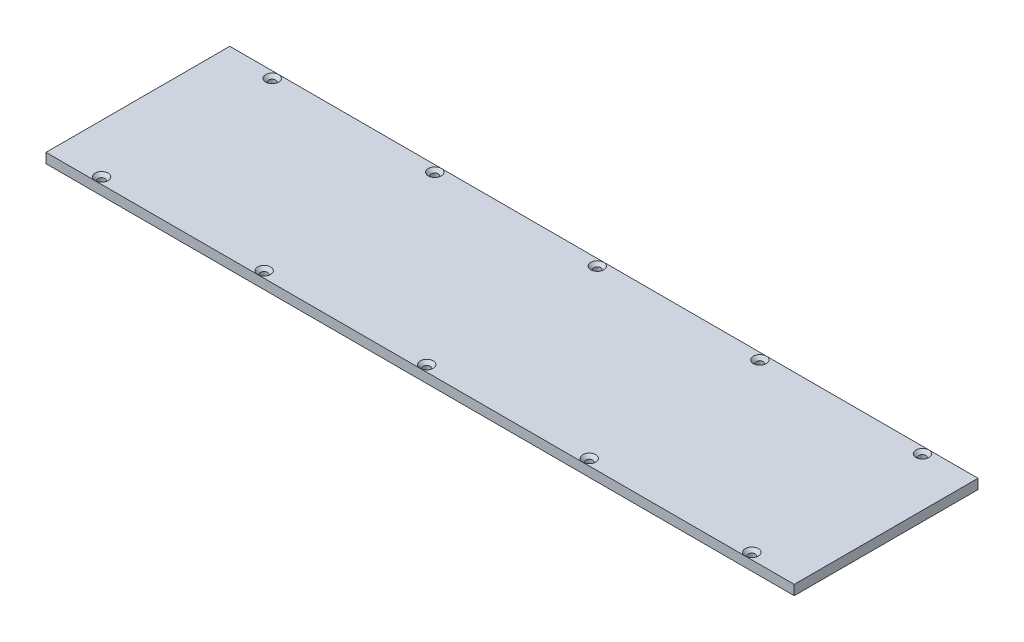
ISO-10303-21;
HEADER;
FILE_DESCRIPTION(('STEP AP214'),'2;1');
FILE_NAME('part.step','',(''),(''),'','','');
FILE_SCHEMA(('AUTOMOTIVE_DESIGN { 1 0 10303 214 1 1 1 1 }'));
ENDSEC;
DATA;
#1=APPLICATION_CONTEXT('core data for automotive mechanical design processes');
#2=APPLICATION_PROTOCOL_DEFINITION('international standard','automotive_design',2000,#1);
#3=PRODUCT_CONTEXT('',#1,'mechanical');
#4=PRODUCT('Part','Part','',(#3));
#5=PRODUCT_RELATED_PRODUCT_CATEGORY('part','',(#4));
#6=PRODUCT_DEFINITION_FORMATION('','',#4);
#7=PRODUCT_DEFINITION_CONTEXT('part definition',#1,'design');
#8=PRODUCT_DEFINITION('design','',#6,#7);
#9=PRODUCT_DEFINITION_SHAPE('','',#8);
#10=(LENGTH_UNIT() NAMED_UNIT(*) SI_UNIT(.MILLI.,.METRE.));
#11=(NAMED_UNIT(*) PLANE_ANGLE_UNIT() SI_UNIT($,.RADIAN.));
#12=(NAMED_UNIT(*) SI_UNIT($,.STERADIAN.) SOLID_ANGLE_UNIT());
#13=UNCERTAINTY_MEASURE_WITH_UNIT(LENGTH_MEASURE(1.E-05),#10,'distance_accuracy_value','');
#14=(GEOMETRIC_REPRESENTATION_CONTEXT(3) GLOBAL_UNCERTAINTY_ASSIGNED_CONTEXT((#13)) GLOBAL_UNIT_ASSIGNED_CONTEXT((#10,
#11,#12)) REPRESENTATION_CONTEXT('',''));
#15=CARTESIAN_POINT('',(0.,0.,0.));
#16=DIRECTION('',(0.,0.,1.));
#17=DIRECTION('',(1.,0.,0.));
#18=AXIS2_PLACEMENT_3D('',#15,#16,#17);
#19=CARTESIAN_POINT('',(361.95,9.525,88.9));
#20=DIRECTION('',(-1.,0.,0.));
#21=DIRECTION('',(0.,0.,1.));
#22=AXIS2_PLACEMENT_3D('',#19,#20,#21);
#23=PLANE('',#22);
#24=DIRECTION('',(0.,0.,-1.));
#25=VECTOR('',#24,1.);
#26=CARTESIAN_POINT('',(361.95,0.,88.9));
#27=LINE('',#26,#25);
#28=CARTESIAN_POINT('',(361.95,0.,88.9));
#29=VERTEX_POINT('',#28);
#30=CARTESIAN_POINT('',(361.95,0.,-88.9));
#31=VERTEX_POINT('',#30);
#32=EDGE_CURVE('E101',#29,#31,#27,.T.);
#33=ORIENTED_EDGE('',*,*,#32,.T.);
#34=DIRECTION('',(0.,-1.,0.));
#35=VECTOR('',#34,1.);
#36=CARTESIAN_POINT('',(361.95,9.525,-88.9));
#37=LINE('',#36,#35);
#38=CARTESIAN_POINT('',(361.95,9.525,-88.9));
#39=VERTEX_POINT('',#38);
#40=EDGE_CURVE('E11',#39,#31,#37,.T.);
#41=ORIENTED_EDGE('',*,*,#40,.F.);
#42=DIRECTION('',(0.,0.,-1.));
#43=VECTOR('',#42,1.);
#44=CARTESIAN_POINT('',(361.95,9.525,88.9));
#45=LINE('',#44,#43);
#46=CARTESIAN_POINT('',(361.95,9.525,88.9));
#47=VERTEX_POINT('',#46);
#48=EDGE_CURVE('E89',#47,#39,#45,.T.);
#49=ORIENTED_EDGE('',*,*,#48,.F.);
#50=DIRECTION('',(0.,-1.,0.));
#51=VECTOR('',#50,1.);
#52=CARTESIAN_POINT('',(361.95,9.525,88.9));
#53=LINE('',#52,#51);
#54=EDGE_CURVE('E97',#47,#29,#53,.T.);
#55=ORIENTED_EDGE('',*,*,#54,.T.);
#56=EDGE_LOOP('',(#33,#41,#49,#55));
#57=FACE_BOUND('',#56,.T.);
#58=ADVANCED_FACE('F38',(#57),#23,.F.);
#59=CARTESIAN_POINT('',(-361.95,9.525,-88.9));
#60=DIRECTION('',(0.,0.,1.));
#61=DIRECTION('',(1.,0.,0.));
#62=AXIS2_PLACEMENT_3D('',#59,#60,#61);
#63=PLANE('',#62);
#64=DIRECTION('',(-1.,0.,0.));
#65=VECTOR('',#64,1.);
#66=CARTESIAN_POINT('',(-361.95,0.,-88.9));
#67=LINE('',#66,#65);
#68=CARTESIAN_POINT('',(-361.95,0.,-88.9));
#69=VERTEX_POINT('',#68);
#70=EDGE_CURVE('E93',#31,#69,#67,.T.);
#71=ORIENTED_EDGE('',*,*,#70,.T.);
#72=DIRECTION('',(0.,-1.,0.));
#73=VECTOR('',#72,1.);
#74=CARTESIAN_POINT('',(-361.95,9.525,-88.9));
#75=LINE('',#74,#73);
#76=CARTESIAN_POINT('',(-361.95,9.525,-88.9));
#77=VERTEX_POINT('',#76);
#78=EDGE_CURVE('E46',#77,#69,#75,.T.);
#79=ORIENTED_EDGE('',*,*,#78,.F.);
#80=DIRECTION('',(-1.,0.,0.));
#81=VECTOR('',#80,1.);
#82=CARTESIAN_POINT('',(-361.95,9.525,-88.9));
#83=LINE('',#82,#81);
#84=EDGE_CURVE('E84',#39,#77,#83,.T.);
#85=ORIENTED_EDGE('',*,*,#84,.F.);
#86=ORIENTED_EDGE('',*,*,#40,.T.);
#87=EDGE_LOOP('',(#71,#79,#85,#86));
#88=FACE_BOUND('',#87,.T.);
#89=ADVANCED_FACE('F92',(#88),#63,.F.);
#90=CARTESIAN_POINT('',(-361.95,9.525,88.9));
#91=DIRECTION('',(1.,0.,0.));
#92=DIRECTION('',(0.,0.,-1.));
#93=AXIS2_PLACEMENT_3D('',#90,#91,#92);
#94=PLANE('',#93);
#95=DIRECTION('',(0.,0.,1.));
#96=VECTOR('',#95,1.);
#97=CARTESIAN_POINT('',(-361.95,0.,88.9));
#98=LINE('',#97,#96);
#99=CARTESIAN_POINT('',(-361.95,0.,88.9));
#100=VERTEX_POINT('',#99);
#101=EDGE_CURVE('E71',#69,#100,#98,.T.);
#102=ORIENTED_EDGE('',*,*,#101,.T.);
#103=DIRECTION('',(0.,-1.,0.));
#104=VECTOR('',#103,1.);
#105=CARTESIAN_POINT('',(-361.95,9.525,88.9));
#106=LINE('',#105,#104);
#107=CARTESIAN_POINT('',(-361.95,9.525,88.9));
#108=VERTEX_POINT('',#107);
#109=EDGE_CURVE('E94',#108,#100,#106,.T.);
#110=ORIENTED_EDGE('',*,*,#109,.F.);
#111=DIRECTION('',(0.,0.,1.));
#112=VECTOR('',#111,1.);
#113=CARTESIAN_POINT('',(-361.95,9.525,88.9));
#114=LINE('',#113,#112);
#115=EDGE_CURVE('E87',#77,#108,#114,.T.);
#116=ORIENTED_EDGE('',*,*,#115,.F.);
#117=ORIENTED_EDGE('',*,*,#78,.T.);
#118=EDGE_LOOP('',(#102,#110,#116,#117));
#119=FACE_BOUND('',#118,.T.);
#120=ADVANCED_FACE('F95',(#119),#94,.F.);
#121=CARTESIAN_POINT('',(-361.95,9.525,88.9));
#122=DIRECTION('',(0.,0.,-1.));
#123=DIRECTION('',(-1.,0.,0.));
#124=AXIS2_PLACEMENT_3D('',#121,#122,#123);
#125=PLANE('',#124);
#126=DIRECTION('',(1.,0.,0.));
#127=VECTOR('',#126,1.);
#128=CARTESIAN_POINT('',(-361.95,0.,88.9));
#129=LINE('',#128,#127);
#130=EDGE_CURVE('E77',#100,#29,#129,.T.);
#131=ORIENTED_EDGE('',*,*,#130,.T.);
#132=ORIENTED_EDGE('',*,*,#54,.F.);
#133=DIRECTION('',(1.,0.,0.));
#134=VECTOR('',#133,1.);
#135=CARTESIAN_POINT('',(-361.95,9.525,88.9));
#136=LINE('',#135,#134);
#137=EDGE_CURVE('E54',#108,#47,#136,.T.);
#138=ORIENTED_EDGE('',*,*,#137,.F.);
#139=ORIENTED_EDGE('',*,*,#109,.T.);
#140=EDGE_LOOP('',(#131,#132,#138,#139));
#141=FACE_BOUND('',#140,.T.);
#142=ADVANCED_FACE('F109',(#141),#125,.F.);
#143=CARTESIAN_POINT('',(0.,9.525,0.));
#144=DIRECTION('',(0.,-1.,0.));
#145=DIRECTION('',(0.,0.,-1.));
#146=AXIS2_PLACEMENT_3D('',#143,#144,#145);
#147=PLANE('',#146);
#148=CARTESIAN_POINT('',(-157.2718,9.525,-82.5500000000001));
#149=DIRECTION('',(0.,1.,0.));
#150=DIRECTION('',(0.,0.,1.));
#151=AXIS2_PLACEMENT_3D('',#148,#149,#150);
#152=CIRCLE('',#151,6.3);
#153=CARTESIAN_POINT('',(-157.2718,9.525,-76.2500000000001));
#154=VERTEX_POINT('',#153);
#155=EDGE_CURVE('E201',#154,#154,#152,.T.);
#156=ORIENTED_EDGE('',*,*,#155,.F.);
#157=EDGE_LOOP('',(#156));
#158=FACE_BOUND('',#157,.T.);
#159=CARTESIAN_POINT('',(157.2718,9.525,-82.5500000000001));
#160=DIRECTION('',(0.,1.,0.));
#161=DIRECTION('',(0.,0.,1.));
#162=AXIS2_PLACEMENT_3D('',#159,#160,#161);
#163=CIRCLE('',#162,6.3);
#164=CARTESIAN_POINT('',(157.2718,9.525,-76.2500000000001));
#165=VERTEX_POINT('',#164);
#166=EDGE_CURVE('E192',#165,#165,#163,.T.);
#167=ORIENTED_EDGE('',*,*,#166,.F.);
#168=EDGE_LOOP('',(#167));
#169=FACE_BOUND('',#168,.T.);
#170=CARTESIAN_POINT('',(-157.2718,9.525,82.5500000000001));
#171=DIRECTION('',(0.,1.,0.));
#172=DIRECTION('',(0.,0.,1.));
#173=AXIS2_PLACEMENT_3D('',#170,#171,#172);
#174=CIRCLE('',#173,6.3);
#175=CARTESIAN_POINT('',(-157.2718,9.525,88.8500000000001));
#176=VERTEX_POINT('',#175);
#177=EDGE_CURVE('E183',#176,#176,#174,.T.);
#178=ORIENTED_EDGE('',*,*,#177,.F.);
#179=EDGE_LOOP('',(#178));
#180=FACE_BOUND('',#179,.T.);
#181=CARTESIAN_POINT('',(157.2718,9.525,82.5500000000001));
#182=DIRECTION('',(0.,1.,0.));
#183=DIRECTION('',(0.,0.,1.));
#184=AXIS2_PLACEMENT_3D('',#181,#182,#183);
#185=CIRCLE('',#184,6.3);
#186=CARTESIAN_POINT('',(157.2718,9.525,88.8500000000001));
#187=VERTEX_POINT('',#186);
#188=EDGE_CURVE('E174',#187,#187,#185,.T.);
#189=ORIENTED_EDGE('',*,*,#188,.F.);
#190=EDGE_LOOP('',(#189));
#191=FACE_BOUND('',#190,.T.);
#192=CARTESIAN_POINT('',(314.5436,9.525,82.55));
#193=DIRECTION('',(0.,1.,0.));
#194=DIRECTION('',(0.,0.,1.));
#195=AXIS2_PLACEMENT_3D('',#192,#193,#194);
#196=CIRCLE('',#195,6.30000000000003);
#197=CARTESIAN_POINT('',(314.5436,9.525,88.85));
#198=VERTEX_POINT('',#197);
#199=EDGE_CURVE('E165',#198,#198,#196,.T.);
#200=ORIENTED_EDGE('',*,*,#199,.F.);
#201=EDGE_LOOP('',(#200));
#202=FACE_BOUND('',#201,.T.);
#203=CARTESIAN_POINT('',(-314.5436,9.525,-82.55));
#204=DIRECTION('',(0.,1.,0.));
#205=DIRECTION('',(0.,0.,1.));
#206=AXIS2_PLACEMENT_3D('',#203,#204,#205);
#207=CIRCLE('',#206,6.30000000000003);
#208=CARTESIAN_POINT('',(-314.5436,9.525,-76.25));
#209=VERTEX_POINT('',#208);
#210=EDGE_CURVE('E156',#209,#209,#207,.T.);
#211=ORIENTED_EDGE('',*,*,#210,.F.);
#212=EDGE_LOOP('',(#211));
#213=FACE_BOUND('',#212,.T.);
#214=CARTESIAN_POINT('',(-314.5436,9.525,82.55));
#215=DIRECTION('',(0.,1.,0.));
#216=DIRECTION('',(0.,0.,1.));
#217=AXIS2_PLACEMENT_3D('',#214,#215,#216);
#218=CIRCLE('',#217,6.30000000000003);
#219=CARTESIAN_POINT('',(-314.5436,9.525,88.85));
#220=VERTEX_POINT('',#219);
#221=EDGE_CURVE('E147',#220,#220,#218,.T.);
#222=ORIENTED_EDGE('',*,*,#221,.F.);
#223=EDGE_LOOP('',(#222));
#224=FACE_BOUND('',#223,.T.);
#225=CARTESIAN_POINT('',(0.,9.525,82.55));
#226=DIRECTION('',(0.,1.,0.));
#227=DIRECTION('',(0.,0.,1.));
#228=AXIS2_PLACEMENT_3D('',#225,#226,#227);
#229=CIRCLE('',#228,6.3);
#230=CARTESIAN_POINT('',(0.,9.525,88.85));
#231=VERTEX_POINT('',#230);
#232=EDGE_CURVE('E138',#231,#231,#229,.T.);
#233=ORIENTED_EDGE('',*,*,#232,.F.);
#234=EDGE_LOOP('',(#233));
#235=FACE_BOUND('',#234,.T.);
#236=CARTESIAN_POINT('',(0.,9.525,-82.55));
#237=DIRECTION('',(0.,1.,0.));
#238=DIRECTION('',(0.,0.,1.));
#239=AXIS2_PLACEMENT_3D('',#236,#237,#238);
#240=CIRCLE('',#239,6.3);
#241=CARTESIAN_POINT('',(0.,9.525,-76.25));
#242=VERTEX_POINT('',#241);
#243=EDGE_CURVE('E129',#242,#242,#240,.T.);
#244=ORIENTED_EDGE('',*,*,#243,.F.);
#245=EDGE_LOOP('',(#244));
#246=FACE_BOUND('',#245,.T.);
#247=CARTESIAN_POINT('',(314.5436,9.525,-82.55));
#248=DIRECTION('',(0.,1.,0.));
#249=DIRECTION('',(0.,0.,1.));
#250=AXIS2_PLACEMENT_3D('',#247,#248,#249);
#251=CIRCLE('',#250,6.30000000000003);
#252=CARTESIAN_POINT('',(314.5436,9.525,-76.25));
#253=VERTEX_POINT('',#252);
#254=EDGE_CURVE('E120',#253,#253,#251,.T.);
#255=ORIENTED_EDGE('',*,*,#254,.F.);
#256=EDGE_LOOP('',(#255));
#257=FACE_BOUND('',#256,.T.);
#258=ORIENTED_EDGE('',*,*,#48,.T.);
#259=ORIENTED_EDGE('',*,*,#84,.T.);
#260=ORIENTED_EDGE('',*,*,#115,.T.);
#261=ORIENTED_EDGE('',*,*,#137,.T.);
#262=EDGE_LOOP('',(#258,#259,#260,#261));
#263=FACE_BOUND('',#262,.T.);
#264=ADVANCED_FACE('F85',(#158,#169,#180,#191,#202,#213,#224,#235,#246,#257,#263),#147,.F.);
#265=CARTESIAN_POINT('',(0.,0.,0.));
#266=DIRECTION('',(0.,-1.,0.));
#267=DIRECTION('',(0.,0.,-1.));
#268=AXIS2_PLACEMENT_3D('',#265,#266,#267);
#269=PLANE('',#268);
#270=CARTESIAN_POINT('',(-157.2718,0.,-82.5500000000001));
#271=DIRECTION('',(0.,1.,0.));
#272=DIRECTION('',(0.,0.,1.));
#273=AXIS2_PLACEMENT_3D('',#270,#271,#272);
#274=CIRCLE('',#273,3.3);
#275=CARTESIAN_POINT('',(-157.2718,0.,-79.2500000000001));
#276=VERTEX_POINT('',#275);
#277=EDGE_CURVE('E195',#276,#276,#274,.T.);
#278=ORIENTED_EDGE('',*,*,#277,.T.);
#279=EDGE_LOOP('',(#278));
#280=FACE_BOUND('',#279,.T.);
#281=CARTESIAN_POINT('',(157.2718,0.,-82.5500000000001));
#282=DIRECTION('',(0.,1.,0.));
#283=DIRECTION('',(0.,0.,1.));
#284=AXIS2_PLACEMENT_3D('',#281,#282,#283);
#285=CIRCLE('',#284,3.3);
#286=CARTESIAN_POINT('',(157.2718,0.,-79.2500000000001));
#287=VERTEX_POINT('',#286);
#288=EDGE_CURVE('E186',#287,#287,#285,.T.);
#289=ORIENTED_EDGE('',*,*,#288,.T.);
#290=EDGE_LOOP('',(#289));
#291=FACE_BOUND('',#290,.T.);
#292=CARTESIAN_POINT('',(-157.2718,0.,82.5500000000001));
#293=DIRECTION('',(0.,1.,0.));
#294=DIRECTION('',(0.,0.,1.));
#295=AXIS2_PLACEMENT_3D('',#292,#293,#294);
#296=CIRCLE('',#295,3.3);
#297=CARTESIAN_POINT('',(-157.2718,0.,85.8500000000001));
#298=VERTEX_POINT('',#297);
#299=EDGE_CURVE('E177',#298,#298,#296,.T.);
#300=ORIENTED_EDGE('',*,*,#299,.T.);
#301=EDGE_LOOP('',(#300));
#302=FACE_BOUND('',#301,.T.);
#303=CARTESIAN_POINT('',(157.2718,0.,82.5500000000001));
#304=DIRECTION('',(0.,1.,0.));
#305=DIRECTION('',(0.,0.,1.));
#306=AXIS2_PLACEMENT_3D('',#303,#304,#305);
#307=CIRCLE('',#306,3.3);
#308=CARTESIAN_POINT('',(157.2718,0.,85.8500000000001));
#309=VERTEX_POINT('',#308);
#310=EDGE_CURVE('E168',#309,#309,#307,.T.);
#311=ORIENTED_EDGE('',*,*,#310,.T.);
#312=EDGE_LOOP('',(#311));
#313=FACE_BOUND('',#312,.T.);
#314=CARTESIAN_POINT('',(314.5436,0.,82.55));
#315=DIRECTION('',(0.,1.,0.));
#316=DIRECTION('',(0.,0.,1.));
#317=AXIS2_PLACEMENT_3D('',#314,#315,#316);
#318=CIRCLE('',#317,3.30000000000003);
#319=CARTESIAN_POINT('',(314.5436,0.,85.85));
#320=VERTEX_POINT('',#319);
#321=EDGE_CURVE('E159',#320,#320,#318,.T.);
#322=ORIENTED_EDGE('',*,*,#321,.T.);
#323=EDGE_LOOP('',(#322));
#324=FACE_BOUND('',#323,.T.);
#325=CARTESIAN_POINT('',(-314.5436,0.,-82.55));
#326=DIRECTION('',(0.,1.,0.));
#327=DIRECTION('',(0.,0.,1.));
#328=AXIS2_PLACEMENT_3D('',#325,#326,#327);
#329=CIRCLE('',#328,3.30000000000003);
#330=CARTESIAN_POINT('',(-314.5436,0.,-79.25));
#331=VERTEX_POINT('',#330);
#332=EDGE_CURVE('E150',#331,#331,#329,.T.);
#333=ORIENTED_EDGE('',*,*,#332,.T.);
#334=EDGE_LOOP('',(#333));
#335=FACE_BOUND('',#334,.T.);
#336=CARTESIAN_POINT('',(-314.5436,0.,82.55));
#337=DIRECTION('',(0.,1.,0.));
#338=DIRECTION('',(0.,0.,1.));
#339=AXIS2_PLACEMENT_3D('',#336,#337,#338);
#340=CIRCLE('',#339,3.30000000000003);
#341=CARTESIAN_POINT('',(-314.5436,0.,85.85));
#342=VERTEX_POINT('',#341);
#343=EDGE_CURVE('E141',#342,#342,#340,.T.);
#344=ORIENTED_EDGE('',*,*,#343,.T.);
#345=EDGE_LOOP('',(#344));
#346=FACE_BOUND('',#345,.T.);
#347=CARTESIAN_POINT('',(0.,0.,82.55));
#348=DIRECTION('',(0.,1.,0.));
#349=DIRECTION('',(0.,0.,1.));
#350=AXIS2_PLACEMENT_3D('',#347,#348,#349);
#351=CIRCLE('',#350,3.3);
#352=CARTESIAN_POINT('',(0.,0.,85.85));
#353=VERTEX_POINT('',#352);
#354=EDGE_CURVE('E132',#353,#353,#351,.T.);
#355=ORIENTED_EDGE('',*,*,#354,.T.);
#356=EDGE_LOOP('',(#355));
#357=FACE_BOUND('',#356,.T.);
#358=CARTESIAN_POINT('',(0.,0.,-82.55));
#359=DIRECTION('',(0.,1.,0.));
#360=DIRECTION('',(0.,0.,1.));
#361=AXIS2_PLACEMENT_3D('',#358,#359,#360);
#362=CIRCLE('',#361,3.3);
#363=CARTESIAN_POINT('',(0.,0.,-79.25));
#364=VERTEX_POINT('',#363);
#365=EDGE_CURVE('E123',#364,#364,#362,.T.);
#366=ORIENTED_EDGE('',*,*,#365,.T.);
#367=EDGE_LOOP('',(#366));
#368=FACE_BOUND('',#367,.T.);
#369=CARTESIAN_POINT('',(314.5436,0.,-82.55));
#370=DIRECTION('',(0.,1.,0.));
#371=DIRECTION('',(0.,0.,1.));
#372=AXIS2_PLACEMENT_3D('',#369,#370,#371);
#373=CIRCLE('',#372,3.30000000000003);
#374=CARTESIAN_POINT('',(314.5436,0.,-79.25));
#375=VERTEX_POINT('',#374);
#376=EDGE_CURVE('E104',#375,#375,#373,.T.);
#377=ORIENTED_EDGE('',*,*,#376,.T.);
#378=EDGE_LOOP('',(#377));
#379=FACE_BOUND('',#378,.T.);
#380=ORIENTED_EDGE('',*,*,#32,.F.);
#381=ORIENTED_EDGE('',*,*,#130,.F.);
#382=ORIENTED_EDGE('',*,*,#101,.F.);
#383=ORIENTED_EDGE('',*,*,#70,.F.);
#384=EDGE_LOOP('',(#380,#381,#382,#383));
#385=FACE_BOUND('',#384,.T.);
#386=ADVANCED_FACE('F112',(#280,#291,#302,#313,#324,#335,#346,#357,#368,#379,#385),#269,.T.);
#387=CARTESIAN_POINT('',(314.5436,9.525,-82.55));
#388=DIRECTION('',(0.,1.,0.));
#389=DIRECTION('',(0.,0.,1.));
#390=AXIS2_PLACEMENT_3D('',#387,#388,#389);
#391=CYLINDRICAL_SURFACE('',#390,3.30000000000003);
#392=ORIENTED_EDGE('',*,*,#376,.F.);
#393=EDGE_LOOP('',(#392));
#394=FACE_BOUND('',#393,.T.);
#395=CARTESIAN_POINT('',(314.5436,6.525,-82.55));
#396=DIRECTION('',(0.,1.,0.));
#397=DIRECTION('',(0.,0.,1.));
#398=AXIS2_PLACEMENT_3D('',#395,#396,#397);
#399=CIRCLE('',#398,3.30000000000003);
#400=CARTESIAN_POINT('',(314.5436,6.525,-79.25));
#401=VERTEX_POINT('',#400);
#402=EDGE_CURVE('E117',#401,#401,#399,.T.);
#403=ORIENTED_EDGE('',*,*,#402,.T.);
#404=EDGE_LOOP('',(#403));
#405=FACE_BOUND('',#404,.T.);
#406=ADVANCED_FACE('F231',(#394,#405),#391,.F.);
#407=CARTESIAN_POINT('',(314.5436,9.525,-82.55));
#408=DIRECTION('',(0.,1.,0.));
#409=DIRECTION('',(0.,0.,1.));
#410=AXIS2_PLACEMENT_3D('',#407,#408,#409);
#411=CONICAL_SURFACE('',#410,6.30000000000003,0.785398163397448);
#412=ORIENTED_EDGE('',*,*,#402,.F.);
#413=EDGE_LOOP('',(#412));
#414=FACE_BOUND('',#413,.T.);
#415=ORIENTED_EDGE('',*,*,#254,.T.);
#416=EDGE_LOOP('',(#415));
#417=FACE_BOUND('',#416,.T.);
#418=ADVANCED_FACE('F228',(#414,#417),#411,.F.);
#419=CARTESIAN_POINT('',(0.,9.525,-82.55));
#420=DIRECTION('',(0.,1.,0.));
#421=DIRECTION('',(0.,0.,1.));
#422=AXIS2_PLACEMENT_3D('',#419,#420,#421);
#423=CYLINDRICAL_SURFACE('',#422,3.3);
#424=ORIENTED_EDGE('',*,*,#365,.F.);
#425=EDGE_LOOP('',(#424));
#426=FACE_BOUND('',#425,.T.);
#427=CARTESIAN_POINT('',(0.,6.525,-82.55));
#428=DIRECTION('',(0.,1.,0.));
#429=DIRECTION('',(0.,0.,1.));
#430=AXIS2_PLACEMENT_3D('',#427,#428,#429);
#431=CIRCLE('',#430,3.3);
#432=CARTESIAN_POINT('',(0.,6.525,-79.25));
#433=VERTEX_POINT('',#432);
#434=EDGE_CURVE('E126',#433,#433,#431,.T.);
#435=ORIENTED_EDGE('',*,*,#434,.T.);
#436=EDGE_LOOP('',(#435));
#437=FACE_BOUND('',#436,.T.);
#438=ADVANCED_FACE('F230',(#426,#437),#423,.F.);
#439=CARTESIAN_POINT('',(0.,9.525,-82.55));
#440=DIRECTION('',(0.,1.,0.));
#441=DIRECTION('',(0.,0.,1.));
#442=AXIS2_PLACEMENT_3D('',#439,#440,#441);
#443=CONICAL_SURFACE('',#442,6.3,0.785398163397448);
#444=ORIENTED_EDGE('',*,*,#434,.F.);
#445=EDGE_LOOP('',(#444));
#446=FACE_BOUND('',#445,.T.);
#447=ORIENTED_EDGE('',*,*,#243,.T.);
#448=EDGE_LOOP('',(#447));
#449=FACE_BOUND('',#448,.T.);
#450=ADVANCED_FACE('F238',(#446,#449),#443,.F.);
#451=CARTESIAN_POINT('',(0.,9.525,82.55));
#452=DIRECTION('',(0.,1.,0.));
#453=DIRECTION('',(0.,0.,1.));
#454=AXIS2_PLACEMENT_3D('',#451,#452,#453);
#455=CYLINDRICAL_SURFACE('',#454,3.3);
#456=ORIENTED_EDGE('',*,*,#354,.F.);
#457=EDGE_LOOP('',(#456));
#458=FACE_BOUND('',#457,.T.);
#459=CARTESIAN_POINT('',(0.,6.525,82.55));
#460=DIRECTION('',(0.,1.,0.));
#461=DIRECTION('',(0.,0.,1.));
#462=AXIS2_PLACEMENT_3D('',#459,#460,#461);
#463=CIRCLE('',#462,3.3);
#464=CARTESIAN_POINT('',(0.,6.525,85.85));
#465=VERTEX_POINT('',#464);
#466=EDGE_CURVE('E135',#465,#465,#463,.T.);
#467=ORIENTED_EDGE('',*,*,#466,.T.);
#468=EDGE_LOOP('',(#467));
#469=FACE_BOUND('',#468,.T.);
#470=ADVANCED_FACE('F284',(#458,#469),#455,.F.);
#471=CARTESIAN_POINT('',(0.,9.525,82.55));
#472=DIRECTION('',(0.,1.,0.));
#473=DIRECTION('',(0.,0.,1.));
#474=AXIS2_PLACEMENT_3D('',#471,#472,#473);
#475=CONICAL_SURFACE('',#474,6.3,0.785398163397448);
#476=ORIENTED_EDGE('',*,*,#466,.F.);
#477=EDGE_LOOP('',(#476));
#478=FACE_BOUND('',#477,.T.);
#479=ORIENTED_EDGE('',*,*,#232,.T.);
#480=EDGE_LOOP('',(#479));
#481=FACE_BOUND('',#480,.T.);
#482=ADVANCED_FACE('F289',(#478,#481),#475,.F.);
#483=CARTESIAN_POINT('',(-314.5436,9.525,82.55));
#484=DIRECTION('',(0.,1.,0.));
#485=DIRECTION('',(0.,0.,1.));
#486=AXIS2_PLACEMENT_3D('',#483,#484,#485);
#487=CYLINDRICAL_SURFACE('',#486,3.30000000000003);
#488=ORIENTED_EDGE('',*,*,#343,.F.);
#489=EDGE_LOOP('',(#488));
#490=FACE_BOUND('',#489,.T.);
#491=CARTESIAN_POINT('',(-314.5436,6.525,82.55));
#492=DIRECTION('',(0.,1.,0.));
#493=DIRECTION('',(0.,0.,1.));
#494=AXIS2_PLACEMENT_3D('',#491,#492,#493);
#495=CIRCLE('',#494,3.30000000000003);
#496=CARTESIAN_POINT('',(-314.5436,6.525,85.85));
#497=VERTEX_POINT('',#496);
#498=EDGE_CURVE('E144',#497,#497,#495,.T.);
#499=ORIENTED_EDGE('',*,*,#498,.T.);
#500=EDGE_LOOP('',(#499));
#501=FACE_BOUND('',#500,.T.);
#502=ADVANCED_FACE('F295',(#490,#501),#487,.F.);
#503=CARTESIAN_POINT('',(-314.5436,9.525,82.55));
#504=DIRECTION('',(0.,1.,0.));
#505=DIRECTION('',(0.,0.,1.));
#506=AXIS2_PLACEMENT_3D('',#503,#504,#505);
#507=CONICAL_SURFACE('',#506,6.30000000000003,0.785398163397448);
#508=ORIENTED_EDGE('',*,*,#498,.F.);
#509=EDGE_LOOP('',(#508));
#510=FACE_BOUND('',#509,.T.);
#511=ORIENTED_EDGE('',*,*,#221,.T.);
#512=EDGE_LOOP('',(#511));
#513=FACE_BOUND('',#512,.T.);
#514=ADVANCED_FACE('F299',(#510,#513),#507,.F.);
#515=CARTESIAN_POINT('',(-314.5436,9.525,-82.55));
#516=DIRECTION('',(0.,1.,0.));
#517=DIRECTION('',(0.,0.,1.));
#518=AXIS2_PLACEMENT_3D('',#515,#516,#517);
#519=CYLINDRICAL_SURFACE('',#518,3.30000000000003);
#520=ORIENTED_EDGE('',*,*,#332,.F.);
#521=EDGE_LOOP('',(#520));
#522=FACE_BOUND('',#521,.T.);
#523=CARTESIAN_POINT('',(-314.5436,6.525,-82.55));
#524=DIRECTION('',(0.,1.,0.));
#525=DIRECTION('',(0.,0.,1.));
#526=AXIS2_PLACEMENT_3D('',#523,#524,#525);
#527=CIRCLE('',#526,3.30000000000003);
#528=CARTESIAN_POINT('',(-314.5436,6.525,-79.25));
#529=VERTEX_POINT('',#528);
#530=EDGE_CURVE('E153',#529,#529,#527,.T.);
#531=ORIENTED_EDGE('',*,*,#530,.T.);
#532=EDGE_LOOP('',(#531));
#533=FACE_BOUND('',#532,.T.);
#534=ADVANCED_FACE('F303',(#522,#533),#519,.F.);
#535=CARTESIAN_POINT('',(-314.5436,9.525,-82.55));
#536=DIRECTION('',(0.,1.,0.));
#537=DIRECTION('',(0.,0.,1.));
#538=AXIS2_PLACEMENT_3D('',#535,#536,#537);
#539=CONICAL_SURFACE('',#538,6.30000000000003,0.785398163397448);
#540=ORIENTED_EDGE('',*,*,#530,.F.);
#541=EDGE_LOOP('',(#540));
#542=FACE_BOUND('',#541,.T.);
#543=ORIENTED_EDGE('',*,*,#210,.T.);
#544=EDGE_LOOP('',(#543));
#545=FACE_BOUND('',#544,.T.);
#546=ADVANCED_FACE('F307',(#542,#545),#539,.F.);
#547=CARTESIAN_POINT('',(314.5436,9.525,82.55));
#548=DIRECTION('',(0.,1.,0.));
#549=DIRECTION('',(0.,0.,1.));
#550=AXIS2_PLACEMENT_3D('',#547,#548,#549);
#551=CYLINDRICAL_SURFACE('',#550,3.30000000000003);
#552=ORIENTED_EDGE('',*,*,#321,.F.);
#553=EDGE_LOOP('',(#552));
#554=FACE_BOUND('',#553,.T.);
#555=CARTESIAN_POINT('',(314.5436,6.525,82.55));
#556=DIRECTION('',(0.,1.,0.));
#557=DIRECTION('',(0.,0.,1.));
#558=AXIS2_PLACEMENT_3D('',#555,#556,#557);
#559=CIRCLE('',#558,3.30000000000003);
#560=CARTESIAN_POINT('',(314.5436,6.525,85.85));
#561=VERTEX_POINT('',#560);
#562=EDGE_CURVE('E162',#561,#561,#559,.T.);
#563=ORIENTED_EDGE('',*,*,#562,.T.);
#564=EDGE_LOOP('',(#563));
#565=FACE_BOUND('',#564,.T.);
#566=ADVANCED_FACE('F311',(#554,#565),#551,.F.);
#567=CARTESIAN_POINT('',(314.5436,9.525,82.55));
#568=DIRECTION('',(0.,1.,0.));
#569=DIRECTION('',(0.,0.,1.));
#570=AXIS2_PLACEMENT_3D('',#567,#568,#569);
#571=CONICAL_SURFACE('',#570,6.30000000000003,0.785398163397448);
#572=ORIENTED_EDGE('',*,*,#562,.F.);
#573=EDGE_LOOP('',(#572));
#574=FACE_BOUND('',#573,.T.);
#575=ORIENTED_EDGE('',*,*,#199,.T.);
#576=EDGE_LOOP('',(#575));
#577=FACE_BOUND('',#576,.T.);
#578=ADVANCED_FACE('F315',(#574,#577),#571,.F.);
#579=CARTESIAN_POINT('',(157.2718,9.525,82.5500000000001));
#580=DIRECTION('',(0.,1.,0.));
#581=DIRECTION('',(0.,0.,1.));
#582=AXIS2_PLACEMENT_3D('',#579,#580,#581);
#583=CYLINDRICAL_SURFACE('',#582,3.3);
#584=ORIENTED_EDGE('',*,*,#310,.F.);
#585=EDGE_LOOP('',(#584));
#586=FACE_BOUND('',#585,.T.);
#587=CARTESIAN_POINT('',(157.2718,6.525,82.5500000000001));
#588=DIRECTION('',(0.,1.,0.));
#589=DIRECTION('',(0.,0.,1.));
#590=AXIS2_PLACEMENT_3D('',#587,#588,#589);
#591=CIRCLE('',#590,3.3);
#592=CARTESIAN_POINT('',(157.2718,6.525,85.8500000000001));
#593=VERTEX_POINT('',#592);
#594=EDGE_CURVE('E171',#593,#593,#591,.T.);
#595=ORIENTED_EDGE('',*,*,#594,.T.);
#596=EDGE_LOOP('',(#595));
#597=FACE_BOUND('',#596,.T.);
#598=ADVANCED_FACE('F319',(#586,#597),#583,.F.);
#599=CARTESIAN_POINT('',(157.2718,9.525,82.5500000000001));
#600=DIRECTION('',(0.,1.,0.));
#601=DIRECTION('',(0.,0.,1.));
#602=AXIS2_PLACEMENT_3D('',#599,#600,#601);
#603=CONICAL_SURFACE('',#602,6.3,0.785398163397448);
#604=ORIENTED_EDGE('',*,*,#594,.F.);
#605=EDGE_LOOP('',(#604));
#606=FACE_BOUND('',#605,.T.);
#607=ORIENTED_EDGE('',*,*,#188,.T.);
#608=EDGE_LOOP('',(#607));
#609=FACE_BOUND('',#608,.T.);
#610=ADVANCED_FACE('F323',(#606,#609),#603,.F.);
#611=CARTESIAN_POINT('',(-157.2718,9.525,82.5500000000001));
#612=DIRECTION('',(0.,1.,0.));
#613=DIRECTION('',(0.,0.,1.));
#614=AXIS2_PLACEMENT_3D('',#611,#612,#613);
#615=CYLINDRICAL_SURFACE('',#614,3.3);
#616=ORIENTED_EDGE('',*,*,#299,.F.);
#617=EDGE_LOOP('',(#616));
#618=FACE_BOUND('',#617,.T.);
#619=CARTESIAN_POINT('',(-157.2718,6.525,82.5500000000001));
#620=DIRECTION('',(0.,1.,0.));
#621=DIRECTION('',(0.,0.,1.));
#622=AXIS2_PLACEMENT_3D('',#619,#620,#621);
#623=CIRCLE('',#622,3.3);
#624=CARTESIAN_POINT('',(-157.2718,6.525,85.8500000000001));
#625=VERTEX_POINT('',#624);
#626=EDGE_CURVE('E180',#625,#625,#623,.T.);
#627=ORIENTED_EDGE('',*,*,#626,.T.);
#628=EDGE_LOOP('',(#627));
#629=FACE_BOUND('',#628,.T.);
#630=ADVANCED_FACE('F327',(#618,#629),#615,.F.);
#631=CARTESIAN_POINT('',(-157.2718,9.525,82.5500000000001));
#632=DIRECTION('',(0.,1.,0.));
#633=DIRECTION('',(0.,0.,1.));
#634=AXIS2_PLACEMENT_3D('',#631,#632,#633);
#635=CONICAL_SURFACE('',#634,6.3,0.785398163397448);
#636=ORIENTED_EDGE('',*,*,#626,.F.);
#637=EDGE_LOOP('',(#636));
#638=FACE_BOUND('',#637,.T.);
#639=ORIENTED_EDGE('',*,*,#177,.T.);
#640=EDGE_LOOP('',(#639));
#641=FACE_BOUND('',#640,.T.);
#642=ADVANCED_FACE('F331',(#638,#641),#635,.F.);
#643=CARTESIAN_POINT('',(157.2718,9.525,-82.5500000000001));
#644=DIRECTION('',(0.,1.,0.));
#645=DIRECTION('',(0.,0.,1.));
#646=AXIS2_PLACEMENT_3D('',#643,#644,#645);
#647=CYLINDRICAL_SURFACE('',#646,3.3);
#648=ORIENTED_EDGE('',*,*,#288,.F.);
#649=EDGE_LOOP('',(#648));
#650=FACE_BOUND('',#649,.T.);
#651=CARTESIAN_POINT('',(157.2718,6.525,-82.5500000000001));
#652=DIRECTION('',(0.,1.,0.));
#653=DIRECTION('',(0.,0.,1.));
#654=AXIS2_PLACEMENT_3D('',#651,#652,#653);
#655=CIRCLE('',#654,3.3);
#656=CARTESIAN_POINT('',(157.2718,6.525,-79.2500000000001));
#657=VERTEX_POINT('',#656);
#658=EDGE_CURVE('E189',#657,#657,#655,.T.);
#659=ORIENTED_EDGE('',*,*,#658,.T.);
#660=EDGE_LOOP('',(#659));
#661=FACE_BOUND('',#660,.T.);
#662=ADVANCED_FACE('F335',(#650,#661),#647,.F.);
#663=CARTESIAN_POINT('',(157.2718,9.525,-82.5500000000001));
#664=DIRECTION('',(0.,1.,0.));
#665=DIRECTION('',(0.,0.,1.));
#666=AXIS2_PLACEMENT_3D('',#663,#664,#665);
#667=CONICAL_SURFACE('',#666,6.3,0.785398163397448);
#668=ORIENTED_EDGE('',*,*,#658,.F.);
#669=EDGE_LOOP('',(#668));
#670=FACE_BOUND('',#669,.T.);
#671=ORIENTED_EDGE('',*,*,#166,.T.);
#672=EDGE_LOOP('',(#671));
#673=FACE_BOUND('',#672,.T.);
#674=ADVANCED_FACE('F339',(#670,#673),#667,.F.);
#675=CARTESIAN_POINT('',(-157.2718,9.525,-82.5500000000001));
#676=DIRECTION('',(0.,1.,0.));
#677=DIRECTION('',(0.,0.,1.));
#678=AXIS2_PLACEMENT_3D('',#675,#676,#677);
#679=CYLINDRICAL_SURFACE('',#678,3.3);
#680=ORIENTED_EDGE('',*,*,#277,.F.);
#681=EDGE_LOOP('',(#680));
#682=FACE_BOUND('',#681,.T.);
#683=CARTESIAN_POINT('',(-157.2718,6.525,-82.5500000000001));
#684=DIRECTION('',(0.,1.,0.));
#685=DIRECTION('',(0.,0.,1.));
#686=AXIS2_PLACEMENT_3D('',#683,#684,#685);
#687=CIRCLE('',#686,3.3);
#688=CARTESIAN_POINT('',(-157.2718,6.525,-79.2500000000001));
#689=VERTEX_POINT('',#688);
#690=EDGE_CURVE('E198',#689,#689,#687,.T.);
#691=ORIENTED_EDGE('',*,*,#690,.T.);
#692=EDGE_LOOP('',(#691));
#693=FACE_BOUND('',#692,.T.);
#694=ADVANCED_FACE('F343',(#682,#693),#679,.F.);
#695=CARTESIAN_POINT('',(-157.2718,9.525,-82.5500000000001));
#696=DIRECTION('',(0.,1.,0.));
#697=DIRECTION('',(0.,0.,1.));
#698=AXIS2_PLACEMENT_3D('',#695,#696,#697);
#699=CONICAL_SURFACE('',#698,6.3,0.785398163397448);
#700=ORIENTED_EDGE('',*,*,#690,.F.);
#701=EDGE_LOOP('',(#700));
#702=FACE_BOUND('',#701,.T.);
#703=ORIENTED_EDGE('',*,*,#155,.T.);
#704=EDGE_LOOP('',(#703));
#705=FACE_BOUND('',#704,.T.);
#706=ADVANCED_FACE('F205',(#702,#705),#699,.F.);
#707=CLOSED_SHELL('',(#58,#89,#120,#142,#264,#386,#406,#418,#438,#450,#470,#482,#502,#514,#534,
#546,#566,#578,#598,#610,#630,#642,#662,#674,#694,#706));
#708=MANIFOLD_SOLID_BREP('B2',#707);
#709=ADVANCED_BREP_SHAPE_REPRESENTATION('',(#18,#708),#14);
#710=SHAPE_DEFINITION_REPRESENTATION(#9,#709);
ENDSEC;
END-ISO-10303-21;
